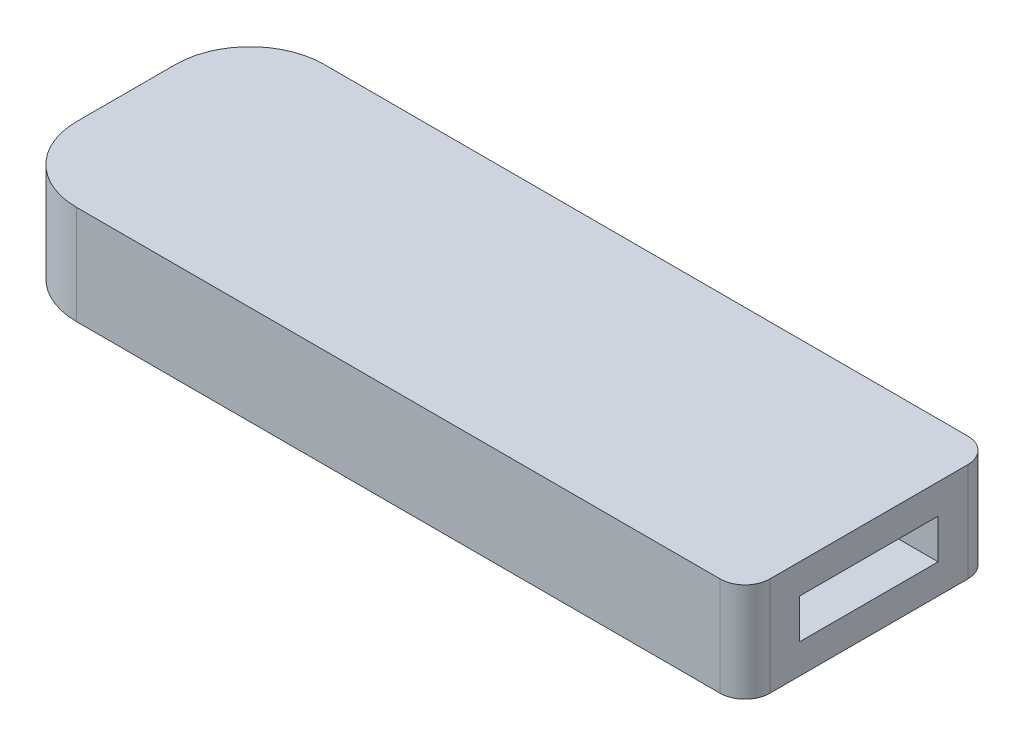
ISO-10303-21;
HEADER;
FILE_DESCRIPTION(('STEP AP214'),'2;1');
FILE_NAME('part.step','',(''),(''),'','','');
FILE_SCHEMA(('AUTOMOTIVE_DESIGN { 1 0 10303 214 1 1 1 1 }'));
ENDSEC;
DATA;
#1=APPLICATION_CONTEXT('core data for automotive mechanical design processes');
#2=APPLICATION_PROTOCOL_DEFINITION('international standard','automotive_design',2000,#1);
#3=PRODUCT_CONTEXT('',#1,'mechanical');
#4=PRODUCT('Part','Part','',(#3));
#5=PRODUCT_RELATED_PRODUCT_CATEGORY('part','',(#4));
#6=PRODUCT_DEFINITION_FORMATION('','',#4);
#7=PRODUCT_DEFINITION_CONTEXT('part definition',#1,'design');
#8=PRODUCT_DEFINITION('design','',#6,#7);
#9=PRODUCT_DEFINITION_SHAPE('','',#8);
#10=(LENGTH_UNIT() NAMED_UNIT(*) SI_UNIT(.MILLI.,.METRE.));
#11=(NAMED_UNIT(*) PLANE_ANGLE_UNIT() SI_UNIT($,.RADIAN.));
#12=(NAMED_UNIT(*) SI_UNIT($,.STERADIAN.) SOLID_ANGLE_UNIT());
#13=UNCERTAINTY_MEASURE_WITH_UNIT(LENGTH_MEASURE(1.E-05),#10,'distance_accuracy_value','');
#14=(GEOMETRIC_REPRESENTATION_CONTEXT(3) GLOBAL_UNCERTAINTY_ASSIGNED_CONTEXT((#13)) GLOBAL_UNIT_ASSIGNED_CONTEXT((#10,
#11,#12)) REPRESENTATION_CONTEXT('',''));
#15=CARTESIAN_POINT('',(0.,0.,0.));
#16=DIRECTION('',(0.,0.,1.));
#17=DIRECTION('',(1.,0.,0.));
#18=AXIS2_PLACEMENT_3D('',#15,#16,#17);
#19=CARTESIAN_POINT('',(0.,4.,0.));
#20=DIRECTION('',(-1.,0.,0.));
#21=DIRECTION('',(0.,0.,1.));
#22=AXIS2_PLACEMENT_3D('',#19,#20,#21);
#23=PLANE('',#22);
#24=DIRECTION('',(0.,0.,-1.));
#25=VECTOR('',#24,1.);
#26=CARTESIAN_POINT('',(0.,1.2,-2.2));
#27=LINE('',#26,#25);
#28=CARTESIAN_POINT('',(0.,1.2,-2.2));
#29=VERTEX_POINT('',#28);
#30=CARTESIAN_POINT('',(0.,1.2,-7.8));
#31=VERTEX_POINT('',#30);
#32=EDGE_CURVE('E164',#29,#31,#27,.T.);
#33=ORIENTED_EDGE('',*,*,#32,.F.);
#34=DIRECTION('',(0.,-1.,0.));
#35=VECTOR('',#34,1.);
#36=CARTESIAN_POINT('',(0.,2.8,-2.2));
#37=LINE('',#36,#35);
#38=CARTESIAN_POINT('',(0.,2.8,-2.2));
#39=VERTEX_POINT('',#38);
#40=EDGE_CURVE('E138',#39,#29,#37,.T.);
#41=ORIENTED_EDGE('',*,*,#40,.F.);
#42=DIRECTION('',(0.,0.,1.));
#43=VECTOR('',#42,1.);
#44=CARTESIAN_POINT('',(0.,2.8,-2.2));
#45=LINE('',#44,#43);
#46=CARTESIAN_POINT('',(0.,2.8,-7.8));
#47=VERTEX_POINT('',#46);
#48=EDGE_CURVE('E155',#47,#39,#45,.T.);
#49=ORIENTED_EDGE('',*,*,#48,.F.);
#50=DIRECTION('',(0.,1.,0.));
#51=VECTOR('',#50,1.);
#52=CARTESIAN_POINT('',(0.,2.8,-7.8));
#53=LINE('',#52,#51);
#54=EDGE_CURVE('E158',#31,#47,#53,.T.);
#55=ORIENTED_EDGE('',*,*,#54,.F.);
#56=EDGE_LOOP('',(#33,#41,#49,#55));
#57=FACE_BOUND('',#56,.T.);
#58=DIRECTION('',(0.,0.,-1.));
#59=VECTOR('',#58,1.);
#60=CARTESIAN_POINT('',(0.,4.,0.));
#61=LINE('',#60,#59);
#62=CARTESIAN_POINT('',(0.,4.,-1.));
#63=VERTEX_POINT('',#62);
#64=CARTESIAN_POINT('',(0.,4.,-9.));
#65=VERTEX_POINT('',#64);
#66=EDGE_CURVE('E174',#63,#65,#61,.T.);
#67=ORIENTED_EDGE('',*,*,#66,.F.);
#68=DIRECTION('',(0.,-1.,0.));
#69=VECTOR('',#68,1.);
#70=CARTESIAN_POINT('',(0.,4.,-1.));
#71=LINE('',#70,#69);
#72=CARTESIAN_POINT('',(0.,0.,-1.));
#73=VERTEX_POINT('',#72);
#74=EDGE_CURVE('E214',#63,#73,#71,.T.);
#75=ORIENTED_EDGE('',*,*,#74,.T.);
#76=DIRECTION('',(0.,0.,-1.));
#77=VECTOR('',#76,1.);
#78=CARTESIAN_POINT('',(0.,0.,0.));
#79=LINE('',#78,#77);
#80=CARTESIAN_POINT('',(0.,0.,-9.));
#81=VERTEX_POINT('',#80);
#82=EDGE_CURVE('E170',#73,#81,#79,.T.);
#83=ORIENTED_EDGE('',*,*,#82,.T.);
#84=DIRECTION('',(0.,-1.,0.));
#85=VECTOR('',#84,1.);
#86=CARTESIAN_POINT('',(0.,4.,-9.));
#87=LINE('',#86,#85);
#88=EDGE_CURVE('E212',#81,#65,#87,.F.);
#89=ORIENTED_EDGE('',*,*,#88,.T.);
#90=EDGE_LOOP('',(#67,#75,#83,#89));
#91=FACE_BOUND('',#90,.T.);
#92=ADVANCED_FACE('F39',(#57,#91),#23,.F.);
#93=CARTESIAN_POINT('',(0.,4.,-10.));
#94=DIRECTION('',(0.,0.,1.));
#95=DIRECTION('',(1.,0.,0.));
#96=AXIS2_PLACEMENT_3D('',#93,#94,#95);
#97=PLANE('',#96);
#98=DIRECTION('',(-1.,0.,0.));
#99=VECTOR('',#98,1.);
#100=CARTESIAN_POINT('',(0.,4.,-10.));
#101=LINE('',#100,#99);
#102=CARTESIAN_POINT('',(-1.,4.,-10.));
#103=VERTEX_POINT('',#102);
#104=CARTESIAN_POINT('',(-27.,4.,-10.));
#105=VERTEX_POINT('',#104);
#106=EDGE_CURVE('E176',#103,#105,#101,.T.);
#107=ORIENTED_EDGE('',*,*,#106,.F.);
#108=DIRECTION('',(0.,-1.,0.));
#109=VECTOR('',#108,1.);
#110=CARTESIAN_POINT('',(-1.,4.,-10.));
#111=LINE('',#110,#109);
#112=CARTESIAN_POINT('',(-1.,0.,-10.));
#113=VERTEX_POINT('',#112);
#114=EDGE_CURVE('E11',#103,#113,#111,.T.);
#115=ORIENTED_EDGE('',*,*,#114,.T.);
#116=DIRECTION('',(-1.,0.,0.));
#117=VECTOR('',#116,1.);
#118=CARTESIAN_POINT('',(0.,0.,-10.));
#119=LINE('',#118,#117);
#120=CARTESIAN_POINT('',(-27.,0.,-10.));
#121=VERTEX_POINT('',#120);
#122=EDGE_CURVE('E187',#113,#121,#119,.T.);
#123=ORIENTED_EDGE('',*,*,#122,.T.);
#124=DIRECTION('',(0.,-1.,0.));
#125=VECTOR('',#124,1.);
#126=CARTESIAN_POINT('',(-27.,4.,-10.));
#127=LINE('',#126,#125);
#128=EDGE_CURVE('E209',#121,#105,#127,.F.);
#129=ORIENTED_EDGE('',*,*,#128,.T.);
#130=EDGE_LOOP('',(#107,#115,#123,#129));
#131=FACE_BOUND('',#130,.T.);
#132=ADVANCED_FACE('F251',(#131),#97,.F.);
#133=CARTESIAN_POINT('',(-30.,4.,0.));
#134=DIRECTION('',(1.,0.,0.));
#135=DIRECTION('',(0.,0.,-1.));
#136=AXIS2_PLACEMENT_3D('',#133,#134,#135);
#137=PLANE('',#136);
#138=DIRECTION('',(0.,0.,1.));
#139=VECTOR('',#138,1.);
#140=CARTESIAN_POINT('',(-30.,0.,0.));
#141=LINE('',#140,#139);
#142=CARTESIAN_POINT('',(-30.,0.,-7.));
#143=VERTEX_POINT('',#142);
#144=CARTESIAN_POINT('',(-30.,0.,-3.));
#145=VERTEX_POINT('',#144);
#146=EDGE_CURVE('E189',#143,#145,#141,.T.);
#147=ORIENTED_EDGE('',*,*,#146,.T.);
#148=DIRECTION('',(0.,-1.,0.));
#149=VECTOR('',#148,1.);
#150=CARTESIAN_POINT('',(-30.,4.,-3.));
#151=LINE('',#150,#149);
#152=CARTESIAN_POINT('',(-30.,4.,-3.));
#153=VERTEX_POINT('',#152);
#154=EDGE_CURVE('E203',#145,#153,#151,.F.);
#155=ORIENTED_EDGE('',*,*,#154,.T.);
#156=DIRECTION('',(0.,0.,1.));
#157=VECTOR('',#156,1.);
#158=CARTESIAN_POINT('',(-30.,4.,0.));
#159=LINE('',#158,#157);
#160=CARTESIAN_POINT('',(-30.,4.,-7.));
#161=VERTEX_POINT('',#160);
#162=EDGE_CURVE('E179',#161,#153,#159,.T.);
#163=ORIENTED_EDGE('',*,*,#162,.F.);
#164=DIRECTION('',(0.,-1.,0.));
#165=VECTOR('',#164,1.);
#166=CARTESIAN_POINT('',(-30.,4.,-7.));
#167=LINE('',#166,#165);
#168=EDGE_CURVE('E200',#161,#143,#167,.T.);
#169=ORIENTED_EDGE('',*,*,#168,.T.);
#170=EDGE_LOOP('',(#147,#155,#163,#169));
#171=FACE_BOUND('',#170,.T.);
#172=ADVANCED_FACE('F242',(#171),#137,.F.);
#173=CARTESIAN_POINT('',(0.,4.,0.));
#174=DIRECTION('',(0.,0.,-1.));
#175=DIRECTION('',(-1.,0.,0.));
#176=AXIS2_PLACEMENT_3D('',#173,#174,#175);
#177=PLANE('',#176);
#178=DIRECTION('',(1.,0.,0.));
#179=VECTOR('',#178,1.);
#180=CARTESIAN_POINT('',(0.,0.,0.));
#181=LINE('',#180,#179);
#182=CARTESIAN_POINT('',(-27.,0.,0.));
#183=VERTEX_POINT('',#182);
#184=CARTESIAN_POINT('',(-1.,0.,0.));
#185=VERTEX_POINT('',#184);
#186=EDGE_CURVE('E177',#183,#185,#181,.T.);
#187=ORIENTED_EDGE('',*,*,#186,.T.);
#188=DIRECTION('',(0.,-1.,0.));
#189=VECTOR('',#188,1.);
#190=CARTESIAN_POINT('',(-1.,4.,0.));
#191=LINE('',#190,#189);
#192=CARTESIAN_POINT('',(-1.,4.,0.));
#193=VERTEX_POINT('',#192);
#194=EDGE_CURVE('E62',#185,#193,#191,.F.);
#195=ORIENTED_EDGE('',*,*,#194,.T.);
#196=DIRECTION('',(1.,0.,0.));
#197=VECTOR('',#196,1.);
#198=CARTESIAN_POINT('',(0.,4.,0.));
#199=LINE('',#198,#197);
#200=CARTESIAN_POINT('',(-27.,4.,0.));
#201=VERTEX_POINT('',#200);
#202=EDGE_CURVE('E182',#201,#193,#199,.T.);
#203=ORIENTED_EDGE('',*,*,#202,.F.);
#204=DIRECTION('',(0.,-1.,0.));
#205=VECTOR('',#204,1.);
#206=CARTESIAN_POINT('',(-27.,4.,0.));
#207=LINE('',#206,#205);
#208=EDGE_CURVE('E184',#201,#183,#207,.T.);
#209=ORIENTED_EDGE('',*,*,#208,.T.);
#210=EDGE_LOOP('',(#187,#195,#203,#209));
#211=FACE_BOUND('',#210,.T.);
#212=ADVANCED_FACE('F234',(#211),#177,.F.);
#213=CARTESIAN_POINT('',(0.,4.,0.));
#214=DIRECTION('',(0.,1.,0.));
#215=DIRECTION('',(0.,0.,1.));
#216=AXIS2_PLACEMENT_3D('',#213,#214,#215);
#217=PLANE('',#216);
#218=ORIENTED_EDGE('',*,*,#202,.T.);
#219=CARTESIAN_POINT('',(-1.,4.,-1.));
#220=DIRECTION('',(0.,1.,0.));
#221=DIRECTION('',(0.,0.,1.));
#222=AXIS2_PLACEMENT_3D('',#219,#220,#221);
#223=CIRCLE('',#222,1.);
#224=EDGE_CURVE('E47',#193,#63,#223,.T.);
#225=ORIENTED_EDGE('',*,*,#224,.T.);
#226=ORIENTED_EDGE('',*,*,#66,.T.);
#227=CARTESIAN_POINT('',(-1.,4.,-9.));
#228=DIRECTION('',(0.,1.,0.));
#229=DIRECTION('',(0.,0.,1.));
#230=AXIS2_PLACEMENT_3D('',#227,#228,#229);
#231=CIRCLE('',#230,1.);
#232=EDGE_CURVE('E54',#65,#103,#231,.T.);
#233=ORIENTED_EDGE('',*,*,#232,.T.);
#234=ORIENTED_EDGE('',*,*,#106,.T.);
#235=CARTESIAN_POINT('',(-27.,4.,-7.));
#236=DIRECTION('',(0.,1.,0.));
#237=DIRECTION('',(0.,0.,1.));
#238=AXIS2_PLACEMENT_3D('',#235,#236,#237);
#239=CIRCLE('',#238,3.);
#240=EDGE_CURVE('E205',#105,#161,#239,.T.);
#241=ORIENTED_EDGE('',*,*,#240,.T.);
#242=ORIENTED_EDGE('',*,*,#162,.T.);
#243=CARTESIAN_POINT('',(-27.,4.,-3.));
#244=DIRECTION('',(0.,1.,0.));
#245=DIRECTION('',(0.,0.,1.));
#246=AXIS2_PLACEMENT_3D('',#243,#244,#245);
#247=CIRCLE('',#246,3.);
#248=EDGE_CURVE('E207',#153,#201,#247,.T.);
#249=ORIENTED_EDGE('',*,*,#248,.T.);
#250=EDGE_LOOP('',(#218,#225,#226,#233,#234,#241,#242,#249));
#251=FACE_BOUND('',#250,.T.);
#252=ADVANCED_FACE('F224',(#251),#217,.T.);
#253=CARTESIAN_POINT('',(0.,0.,0.));
#254=DIRECTION('',(0.,1.,0.));
#255=DIRECTION('',(0.,0.,1.));
#256=AXIS2_PLACEMENT_3D('',#253,#254,#255);
#257=PLANE('',#256);
#258=ORIENTED_EDGE('',*,*,#82,.F.);
#259=CARTESIAN_POINT('',(-1.,0.,-1.));
#260=DIRECTION('',(0.,1.,0.));
#261=DIRECTION('',(0.,0.,1.));
#262=AXIS2_PLACEMENT_3D('',#259,#260,#261);
#263=CIRCLE('',#262,1.);
#264=EDGE_CURVE('E219',#73,#185,#263,.F.);
#265=ORIENTED_EDGE('',*,*,#264,.T.);
#266=ORIENTED_EDGE('',*,*,#186,.F.);
#267=CARTESIAN_POINT('',(-27.,0.,-3.));
#268=DIRECTION('',(0.,1.,0.));
#269=DIRECTION('',(0.,0.,1.));
#270=AXIS2_PLACEMENT_3D('',#267,#268,#269);
#271=CIRCLE('',#270,3.);
#272=EDGE_CURVE('E198',#183,#145,#271,.F.);
#273=ORIENTED_EDGE('',*,*,#272,.T.);
#274=ORIENTED_EDGE('',*,*,#146,.F.);
#275=CARTESIAN_POINT('',(-27.,0.,-7.));
#276=DIRECTION('',(0.,1.,0.));
#277=DIRECTION('',(0.,0.,1.));
#278=AXIS2_PLACEMENT_3D('',#275,#276,#277);
#279=CIRCLE('',#278,3.);
#280=EDGE_CURVE('E195',#143,#121,#279,.F.);
#281=ORIENTED_EDGE('',*,*,#280,.T.);
#282=ORIENTED_EDGE('',*,*,#122,.F.);
#283=CARTESIAN_POINT('',(-1.,0.,-9.));
#284=DIRECTION('',(0.,1.,0.));
#285=DIRECTION('',(0.,0.,1.));
#286=AXIS2_PLACEMENT_3D('',#283,#284,#285);
#287=CIRCLE('',#286,1.);
#288=EDGE_CURVE('E217',#113,#81,#287,.F.);
#289=ORIENTED_EDGE('',*,*,#288,.T.);
#290=EDGE_LOOP('',(#258,#265,#266,#273,#274,#281,#282,#289));
#291=FACE_BOUND('',#290,.T.);
#292=ADVANCED_FACE('F233',(#291),#257,.F.);
#293=CARTESIAN_POINT('',(-13.,2.8,-2.2));
#294=DIRECTION('',(0.,0.,1.));
#295=DIRECTION('',(1.,0.,0.));
#296=AXIS2_PLACEMENT_3D('',#293,#294,#295);
#297=PLANE('',#296);
#298=ORIENTED_EDGE('',*,*,#40,.T.);
#299=DIRECTION('',(1.,0.,0.));
#300=VECTOR('',#299,1.);
#301=CARTESIAN_POINT('',(-13.,1.2,-2.2));
#302=LINE('',#301,#300);
#303=CARTESIAN_POINT('',(-13.,1.2,-2.2));
#304=VERTEX_POINT('',#303);
#305=EDGE_CURVE('E131',#304,#29,#302,.T.);
#306=ORIENTED_EDGE('',*,*,#305,.F.);
#307=DIRECTION('',(0.,-1.,0.));
#308=VECTOR('',#307,1.);
#309=CARTESIAN_POINT('',(-13.,2.8,-2.2));
#310=LINE('',#309,#308);
#311=CARTESIAN_POINT('',(-13.,2.8,-2.2));
#312=VERTEX_POINT('',#311);
#313=EDGE_CURVE('E135',#312,#304,#310,.T.);
#314=ORIENTED_EDGE('',*,*,#313,.F.);
#315=DIRECTION('',(1.,0.,0.));
#316=VECTOR('',#315,1.);
#317=CARTESIAN_POINT('',(-13.,2.8,-2.2));
#318=LINE('',#317,#316);
#319=EDGE_CURVE('E168',#312,#39,#318,.T.);
#320=ORIENTED_EDGE('',*,*,#319,.T.);
#321=EDGE_LOOP('',(#298,#306,#314,#320));
#322=FACE_BOUND('',#321,.T.);
#323=ADVANCED_FACE('F133',(#322),#297,.F.);
#324=CARTESIAN_POINT('',(-13.,2.8,-2.2));
#325=DIRECTION('',(0.,1.,0.));
#326=DIRECTION('',(0.,0.,1.));
#327=AXIS2_PLACEMENT_3D('',#324,#325,#326);
#328=PLANE('',#327);
#329=ORIENTED_EDGE('',*,*,#48,.T.);
#330=ORIENTED_EDGE('',*,*,#319,.F.);
#331=DIRECTION('',(0.,0.,1.));
#332=VECTOR('',#331,1.);
#333=CARTESIAN_POINT('',(-13.,2.8,-2.2));
#334=LINE('',#333,#332);
#335=CARTESIAN_POINT('',(-13.,2.8,-7.8));
#336=VERTEX_POINT('',#335);
#337=EDGE_CURVE('E143',#336,#312,#334,.T.);
#338=ORIENTED_EDGE('',*,*,#337,.F.);
#339=DIRECTION('',(1.,0.,0.));
#340=VECTOR('',#339,1.);
#341=CARTESIAN_POINT('',(-13.,2.8,-7.8));
#342=LINE('',#341,#340);
#343=EDGE_CURVE('E171',#336,#47,#342,.T.);
#344=ORIENTED_EDGE('',*,*,#343,.T.);
#345=EDGE_LOOP('',(#329,#330,#338,#344));
#346=FACE_BOUND('',#345,.T.);
#347=ADVANCED_FACE('F338',(#346),#328,.F.);
#348=CARTESIAN_POINT('',(-13.,2.8,-7.8));
#349=DIRECTION('',(0.,0.,-1.));
#350=DIRECTION('',(-1.,0.,0.));
#351=AXIS2_PLACEMENT_3D('',#348,#349,#350);
#352=PLANE('',#351);
#353=ORIENTED_EDGE('',*,*,#54,.T.);
#354=ORIENTED_EDGE('',*,*,#343,.F.);
#355=DIRECTION('',(0.,1.,0.));
#356=VECTOR('',#355,1.);
#357=CARTESIAN_POINT('',(-13.,2.8,-7.8));
#358=LINE('',#357,#356);
#359=CARTESIAN_POINT('',(-13.,1.2,-7.8));
#360=VERTEX_POINT('',#359);
#361=EDGE_CURVE('E151',#360,#336,#358,.T.);
#362=ORIENTED_EDGE('',*,*,#361,.F.);
#363=DIRECTION('',(1.,0.,0.));
#364=VECTOR('',#363,1.);
#365=CARTESIAN_POINT('',(-13.,1.2,-7.8));
#366=LINE('',#365,#364);
#367=EDGE_CURVE('E142',#360,#31,#366,.T.);
#368=ORIENTED_EDGE('',*,*,#367,.T.);
#369=EDGE_LOOP('',(#353,#354,#362,#368));
#370=FACE_BOUND('',#369,.T.);
#371=ADVANCED_FACE('F327',(#370),#352,.F.);
#372=CARTESIAN_POINT('',(-13.,1.2,-2.2));
#373=DIRECTION('',(0.,-1.,0.));
#374=DIRECTION('',(0.,0.,-1.));
#375=AXIS2_PLACEMENT_3D('',#372,#373,#374);
#376=PLANE('',#375);
#377=ORIENTED_EDGE('',*,*,#32,.T.);
#378=ORIENTED_EDGE('',*,*,#367,.F.);
#379=DIRECTION('',(0.,0.,-1.));
#380=VECTOR('',#379,1.);
#381=CARTESIAN_POINT('',(-13.,1.2,-2.2));
#382=LINE('',#381,#380);
#383=EDGE_CURVE('E146',#304,#360,#382,.T.);
#384=ORIENTED_EDGE('',*,*,#383,.F.);
#385=ORIENTED_EDGE('',*,*,#305,.T.);
#386=EDGE_LOOP('',(#377,#378,#384,#385));
#387=FACE_BOUND('',#386,.T.);
#388=ADVANCED_FACE('F147',(#387),#376,.F.);
#389=CARTESIAN_POINT('',(-13.,0.,0.));
#390=DIRECTION('',(1.,0.,0.));
#391=DIRECTION('',(0.,0.,-1.));
#392=AXIS2_PLACEMENT_3D('',#389,#390,#391);
#393=PLANE('',#392);
#394=ORIENTED_EDGE('',*,*,#313,.T.);
#395=ORIENTED_EDGE('',*,*,#383,.T.);
#396=ORIENTED_EDGE('',*,*,#361,.T.);
#397=ORIENTED_EDGE('',*,*,#337,.T.);
#398=EDGE_LOOP('',(#394,#395,#396,#397));
#399=FACE_BOUND('',#398,.T.);
#400=ADVANCED_FACE('F153',(#399),#393,.T.);
#401=CARTESIAN_POINT('',(-27.,4.,-3.));
#402=DIRECTION('',(0.,-1.,0.));
#403=DIRECTION('',(0.,0.,-1.));
#404=AXIS2_PLACEMENT_3D('',#401,#402,#403);
#405=CYLINDRICAL_SURFACE('',#404,3.);
#406=ORIENTED_EDGE('',*,*,#248,.F.);
#407=ORIENTED_EDGE('',*,*,#154,.F.);
#408=ORIENTED_EDGE('',*,*,#272,.F.);
#409=ORIENTED_EDGE('',*,*,#208,.F.);
#410=EDGE_LOOP('',(#406,#407,#408,#409));
#411=FACE_BOUND('',#410,.T.);
#412=ADVANCED_FACE('F238',(#411),#405,.T.);
#413=CARTESIAN_POINT('',(-27.,4.,-7.));
#414=DIRECTION('',(0.,-1.,0.));
#415=DIRECTION('',(0.,0.,-1.));
#416=AXIS2_PLACEMENT_3D('',#413,#414,#415);
#417=CYLINDRICAL_SURFACE('',#416,3.);
#418=ORIENTED_EDGE('',*,*,#240,.F.);
#419=ORIENTED_EDGE('',*,*,#128,.F.);
#420=ORIENTED_EDGE('',*,*,#280,.F.);
#421=ORIENTED_EDGE('',*,*,#168,.F.);
#422=EDGE_LOOP('',(#418,#419,#420,#421));
#423=FACE_BOUND('',#422,.T.);
#424=ADVANCED_FACE('F247',(#423),#417,.T.);
#425=CARTESIAN_POINT('',(-1.,4.,-1.));
#426=DIRECTION('',(0.,-1.,0.));
#427=DIRECTION('',(0.,0.,-1.));
#428=AXIS2_PLACEMENT_3D('',#425,#426,#427);
#429=CYLINDRICAL_SURFACE('',#428,1.);
#430=ORIENTED_EDGE('',*,*,#224,.F.);
#431=ORIENTED_EDGE('',*,*,#194,.F.);
#432=ORIENTED_EDGE('',*,*,#264,.F.);
#433=ORIENTED_EDGE('',*,*,#74,.F.);
#434=EDGE_LOOP('',(#430,#431,#432,#433));
#435=FACE_BOUND('',#434,.T.);
#436=ADVANCED_FACE('F230',(#435),#429,.T.);
#437=CARTESIAN_POINT('',(-1.,4.,-9.));
#438=DIRECTION('',(0.,-1.,0.));
#439=DIRECTION('',(0.,0.,-1.));
#440=AXIS2_PLACEMENT_3D('',#437,#438,#439);
#441=CYLINDRICAL_SURFACE('',#440,1.);
#442=ORIENTED_EDGE('',*,*,#232,.F.);
#443=ORIENTED_EDGE('',*,*,#88,.F.);
#444=ORIENTED_EDGE('',*,*,#288,.F.);
#445=ORIENTED_EDGE('',*,*,#114,.F.);
#446=EDGE_LOOP('',(#442,#443,#444,#445));
#447=FACE_BOUND('',#446,.T.);
#448=ADVANCED_FACE('F41',(#447),#441,.T.);
#449=CLOSED_SHELL('',(#92,#132,#172,#212,#252,#292,#323,#347,#371,#388,#400,#412,#424,#436,#448));
#450=MANIFOLD_SOLID_BREP('B2',#449);
#451=ADVANCED_BREP_SHAPE_REPRESENTATION('',(#18,#450),#14);
#452=SHAPE_DEFINITION_REPRESENTATION(#9,#451);
ENDSEC;
END-ISO-10303-21;
